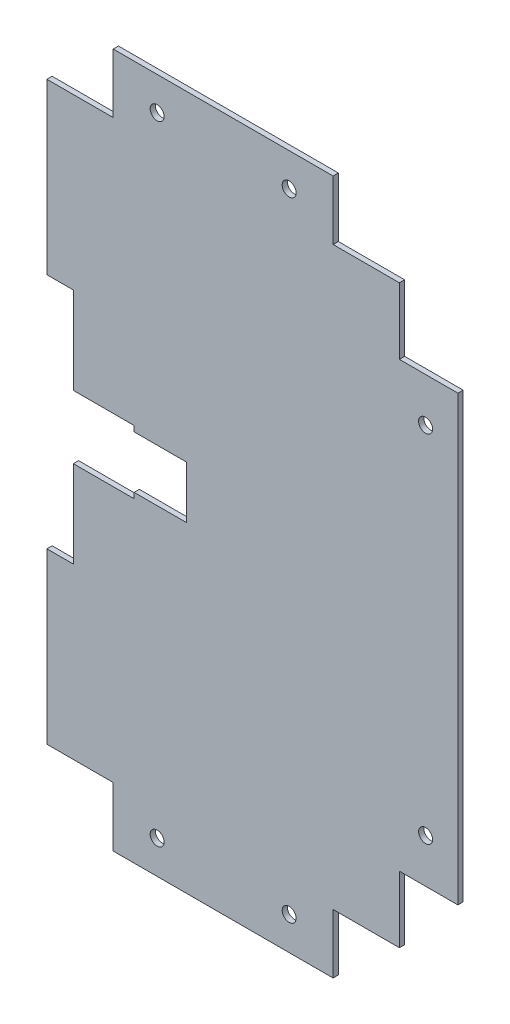
ISO-10303-21;
HEADER;
FILE_DESCRIPTION(('STEP AP214'),'2;1');
FILE_NAME('part.step','',(''),(''),'','','');
FILE_SCHEMA(('AUTOMOTIVE_DESIGN { 1 0 10303 214 1 1 1 1 }'));
ENDSEC;
DATA;
#1=APPLICATION_CONTEXT('core data for automotive mechanical design processes');
#2=APPLICATION_PROTOCOL_DEFINITION('international standard','automotive_design',2000,#1);
#3=PRODUCT_CONTEXT('',#1,'mechanical');
#4=PRODUCT('Part','Part','',(#3));
#5=PRODUCT_RELATED_PRODUCT_CATEGORY('part','',(#4));
#6=PRODUCT_DEFINITION_FORMATION('','',#4);
#7=PRODUCT_DEFINITION_CONTEXT('part definition',#1,'design');
#8=PRODUCT_DEFINITION('design','',#6,#7);
#9=PRODUCT_DEFINITION_SHAPE('','',#8);
#10=(LENGTH_UNIT() NAMED_UNIT(*) SI_UNIT(.MILLI.,.METRE.));
#11=(NAMED_UNIT(*) PLANE_ANGLE_UNIT() SI_UNIT($,.RADIAN.));
#12=(NAMED_UNIT(*) SI_UNIT($,.STERADIAN.) SOLID_ANGLE_UNIT());
#13=UNCERTAINTY_MEASURE_WITH_UNIT(LENGTH_MEASURE(1.E-05),#10,'distance_accuracy_value','');
#14=(GEOMETRIC_REPRESENTATION_CONTEXT(3) GLOBAL_UNCERTAINTY_ASSIGNED_CONTEXT((#13)) GLOBAL_UNIT_ASSIGNED_CONTEXT((#10,
#11,#12)) REPRESENTATION_CONTEXT('',''));
#15=CARTESIAN_POINT('',(0.,0.,0.));
#16=DIRECTION('',(0.,0.,1.));
#17=DIRECTION('',(1.,0.,0.));
#18=AXIS2_PLACEMENT_3D('',#15,#16,#17);
#19=CARTESIAN_POINT('',(76.83,0.,3.));
#20=DIRECTION('',(-1.,0.,0.));
#21=DIRECTION('',(0.,0.,1.));
#22=AXIS2_PLACEMENT_3D('',#19,#20,#21);
#23=PLANE('',#22);
#24=DIRECTION('',(0.,1.,0.));
#25=VECTOR('',#24,1.);
#26=CARTESIAN_POINT('',(76.83,0.,0.));
#27=LINE('',#26,#25);
#28=CARTESIAN_POINT('',(76.83,183.995,0.));
#29=VERTEX_POINT('',#28);
#30=CARTESIAN_POINT('',(76.83,213.995,0.));
#31=VERTEX_POINT('',#30);
#32=EDGE_CURVE('E285',#29,#31,#27,.T.);
#33=ORIENTED_EDGE('',*,*,#32,.F.);
#34=DIRECTION('',(0.,0.,-1.));
#35=VECTOR('',#34,1.);
#36=CARTESIAN_POINT('',(76.83,183.995,3.));
#37=LINE('',#36,#35);
#38=CARTESIAN_POINT('',(76.83,183.995,3.));
#39=VERTEX_POINT('',#38);
#40=EDGE_CURVE('E11',#39,#29,#37,.T.);
#41=ORIENTED_EDGE('',*,*,#40,.F.);
#42=DIRECTION('',(0.,1.,0.));
#43=VECTOR('',#42,1.);
#44=CARTESIAN_POINT('',(76.83,0.,3.));
#45=LINE('',#44,#43);
#46=CARTESIAN_POINT('',(76.83,213.995,3.));
#47=VERTEX_POINT('',#46);
#48=EDGE_CURVE('E509',#39,#47,#45,.T.);
#49=ORIENTED_EDGE('',*,*,#48,.T.);
#50=DIRECTION('',(0.,0.,-1.));
#51=VECTOR('',#50,1.);
#52=CARTESIAN_POINT('',(76.83,213.995,3.));
#53=LINE('',#52,#51);
#54=EDGE_CURVE('E153',#47,#31,#53,.T.);
#55=ORIENTED_EDGE('',*,*,#54,.T.);
#56=EDGE_LOOP('',(#33,#41,#49,#55));
#57=FACE_BOUND('',#56,.T.);
#58=ADVANCED_FACE('F41',(#57),#23,.T.);
#59=CARTESIAN_POINT('',(0.,183.995,3.));
#60=DIRECTION('',(0.,1.,0.));
#61=DIRECTION('',(0.,0.,1.));
#62=AXIS2_PLACEMENT_3D('',#59,#60,#61);
#63=PLANE('',#62);
#64=DIRECTION('',(1.,0.,0.));
#65=VECTOR('',#64,1.);
#66=CARTESIAN_POINT('',(0.,183.995,0.));
#67=LINE('',#66,#65);
#68=CARTESIAN_POINT('',(46.835,183.995,0.));
#69=VERTEX_POINT('',#68);
#70=EDGE_CURVE('E289',#69,#29,#67,.T.);
#71=ORIENTED_EDGE('',*,*,#70,.F.);
#72=DIRECTION('',(0.,0.,-1.));
#73=VECTOR('',#72,1.);
#74=CARTESIAN_POINT('',(46.835,183.995,3.));
#75=LINE('',#74,#73);
#76=CARTESIAN_POINT('',(46.835,183.995,3.));
#77=VERTEX_POINT('',#76);
#78=EDGE_CURVE('E51',#77,#69,#75,.T.);
#79=ORIENTED_EDGE('',*,*,#78,.F.);
#80=DIRECTION('',(1.,0.,0.));
#81=VECTOR('',#80,1.);
#82=CARTESIAN_POINT('',(0.,183.995,3.));
#83=LINE('',#82,#81);
#84=EDGE_CURVE('E507',#77,#39,#83,.T.);
#85=ORIENTED_EDGE('',*,*,#84,.T.);
#86=ORIENTED_EDGE('',*,*,#40,.T.);
#87=EDGE_LOOP('',(#71,#79,#85,#86));
#88=FACE_BOUND('',#87,.T.);
#89=ADVANCED_FACE('F506',(#88),#63,.T.);
#90=CARTESIAN_POINT('',(46.8350000000003,0.,3.));
#91=DIRECTION('',(1.,0.,0.));
#92=DIRECTION('',(0.,1.,0.));
#93=AXIS2_PLACEMENT_3D('',#90,#91,#92);
#94=PLANE('',#93);
#95=DIRECTION('',(0.,-1.,0.));
#96=VECTOR('',#95,1.);
#97=CARTESIAN_POINT('',(46.8350000000003,0.,0.));
#98=LINE('',#97,#96);
#99=CARTESIAN_POINT('',(46.835,180.82,0.));
#100=VERTEX_POINT('',#99);
#101=EDGE_CURVE('E293',#69,#100,#98,.T.);
#102=ORIENTED_EDGE('',*,*,#101,.T.);
#103=DIRECTION('',(0.,0.,-1.));
#104=VECTOR('',#103,1.);
#105=CARTESIAN_POINT('',(46.835,180.82,3.));
#106=LINE('',#105,#104);
#107=CARTESIAN_POINT('',(46.835,180.82,3.));
#108=VERTEX_POINT('',#107);
#109=EDGE_CURVE('E488',#108,#100,#106,.T.);
#110=ORIENTED_EDGE('',*,*,#109,.F.);
#111=DIRECTION('',(0.,-1.,0.));
#112=VECTOR('',#111,1.);
#113=CARTESIAN_POINT('',(46.8350000000003,0.,3.));
#114=LINE('',#113,#112);
#115=EDGE_CURVE('E498',#77,#108,#114,.T.);
#116=ORIENTED_EDGE('',*,*,#115,.F.);
#117=ORIENTED_EDGE('',*,*,#78,.T.);
#118=EDGE_LOOP('',(#102,#110,#116,#117));
#119=FACE_BOUND('',#118,.T.);
#120=ADVANCED_FACE('F495',(#119),#94,.F.);
#121=CARTESIAN_POINT('',(-1.44093114637325E-13,180.82,3.));
#122=DIRECTION('',(0.,-1.,0.));
#123=DIRECTION('',(1.,0.,0.));
#124=AXIS2_PLACEMENT_3D('',#121,#122,#123);
#125=PLANE('',#124);
#126=DIRECTION('',(-1.,0.,0.));
#127=VECTOR('',#126,1.);
#128=CARTESIAN_POINT('',(-1.44093114637325E-13,180.82,0.));
#129=LINE('',#128,#127);
#130=CARTESIAN_POINT('',(12.005,180.82,0.));
#131=VERTEX_POINT('',#130);
#132=EDGE_CURVE('E297',#100,#131,#129,.T.);
#133=ORIENTED_EDGE('',*,*,#132,.T.);
#134=DIRECTION('',(0.,0.,-1.));
#135=VECTOR('',#134,1.);
#136=CARTESIAN_POINT('',(12.005,180.82,3.));
#137=LINE('',#136,#135);
#138=CARTESIAN_POINT('',(12.005,180.82,3.));
#139=VERTEX_POINT('',#138);
#140=EDGE_CURVE('E484',#139,#131,#137,.T.);
#141=ORIENTED_EDGE('',*,*,#140,.F.);
#142=DIRECTION('',(-1.,0.,0.));
#143=VECTOR('',#142,1.);
#144=CARTESIAN_POINT('',(-1.44093114637325E-13,180.82,3.));
#145=LINE('',#144,#143);
#146=EDGE_CURVE('E520',#108,#139,#145,.T.);
#147=ORIENTED_EDGE('',*,*,#146,.F.);
#148=ORIENTED_EDGE('',*,*,#109,.T.);
#149=EDGE_LOOP('',(#133,#141,#147,#148));
#150=FACE_BOUND('',#149,.T.);
#151=ADVANCED_FACE('F681',(#150),#125,.F.);
#152=CARTESIAN_POINT('',(12.005,0.,3.));
#153=DIRECTION('',(1.,0.,0.));
#154=DIRECTION('',(0.,0.,-1.));
#155=AXIS2_PLACEMENT_3D('',#152,#153,#154);
#156=PLANE('',#155);
#157=DIRECTION('',(0.,-1.,0.));
#158=VECTOR('',#157,1.);
#159=CARTESIAN_POINT('',(12.005,0.,0.));
#160=LINE('',#159,#158);
#161=CARTESIAN_POINT('',(12.005,130.995,0.));
#162=VERTEX_POINT('',#161);
#163=EDGE_CURVE('E301',#131,#162,#160,.T.);
#164=ORIENTED_EDGE('',*,*,#163,.T.);
#165=DIRECTION('',(0.,0.,-1.));
#166=VECTOR('',#165,1.);
#167=CARTESIAN_POINT('',(12.005,130.995,3.));
#168=LINE('',#167,#166);
#169=CARTESIAN_POINT('',(12.005,130.995,3.));
#170=VERTEX_POINT('',#169);
#171=EDGE_CURVE('E480',#170,#162,#168,.T.);
#172=ORIENTED_EDGE('',*,*,#171,.F.);
#173=DIRECTION('',(0.,-1.,0.));
#174=VECTOR('',#173,1.);
#175=CARTESIAN_POINT('',(12.005,0.,3.));
#176=LINE('',#175,#174);
#177=EDGE_CURVE('E524',#139,#170,#176,.T.);
#178=ORIENTED_EDGE('',*,*,#177,.F.);
#179=ORIENTED_EDGE('',*,*,#140,.T.);
#180=EDGE_LOOP('',(#164,#172,#178,#179));
#181=FACE_BOUND('',#180,.T.);
#182=ADVANCED_FACE('F678',(#181),#156,.F.);
#183=CARTESIAN_POINT('',(0.,130.995,3.));
#184=DIRECTION('',(0.,-1.,0.));
#185=DIRECTION('',(0.,0.,-1.));
#186=AXIS2_PLACEMENT_3D('',#183,#184,#185);
#187=PLANE('',#186);
#188=DIRECTION('',(-1.,0.,0.));
#189=VECTOR('',#188,1.);
#190=CARTESIAN_POINT('',(0.,130.995,0.));
#191=LINE('',#190,#189);
#192=CARTESIAN_POINT('',(-3.17500000000001,130.995,0.));
#193=VERTEX_POINT('',#192);
#194=EDGE_CURVE('E305',#162,#193,#191,.T.);
#195=ORIENTED_EDGE('',*,*,#194,.T.);
#196=DIRECTION('',(0.,0.,-1.));
#197=VECTOR('',#196,1.);
#198=CARTESIAN_POINT('',(-3.17500000000001,130.995,3.));
#199=LINE('',#198,#197);
#200=CARTESIAN_POINT('',(-3.17500000000001,130.995,3.));
#201=VERTEX_POINT('',#200);
#202=EDGE_CURVE('E477',#201,#193,#199,.T.);
#203=ORIENTED_EDGE('',*,*,#202,.F.);
#204=DIRECTION('',(-1.,0.,0.));
#205=VECTOR('',#204,1.);
#206=CARTESIAN_POINT('',(0.,130.995,3.));
#207=LINE('',#206,#205);
#208=EDGE_CURVE('E528',#170,#201,#207,.T.);
#209=ORIENTED_EDGE('',*,*,#208,.F.);
#210=ORIENTED_EDGE('',*,*,#171,.T.);
#211=EDGE_LOOP('',(#195,#203,#209,#210));
#212=FACE_BOUND('',#211,.T.);
#213=ADVANCED_FACE('F676',(#212),#187,.F.);
#214=CARTESIAN_POINT('',(-3.17500000000001,0.,3.));
#215=DIRECTION('',(-1.,0.,0.));
#216=DIRECTION('',(0.,0.,1.));
#217=AXIS2_PLACEMENT_3D('',#214,#215,#216);
#218=PLANE('',#217);
#219=DIRECTION('',(0.,1.,0.));
#220=VECTOR('',#219,1.);
#221=CARTESIAN_POINT('',(-3.17500000000001,0.,0.));
#222=LINE('',#221,#220);
#223=CARTESIAN_POINT('',(-3.17500000000001,34.005,0.));
#224=VERTEX_POINT('',#223);
#225=EDGE_CURVE('E309',#224,#193,#222,.T.);
#226=ORIENTED_EDGE('',*,*,#225,.F.);
#227=DIRECTION('',(0.,0.,-1.));
#228=VECTOR('',#227,1.);
#229=CARTESIAN_POINT('',(-3.17500000000001,34.005,3.));
#230=LINE('',#229,#228);
#231=CARTESIAN_POINT('',(-3.17500000000001,34.005,3.));
#232=VERTEX_POINT('',#231);
#233=EDGE_CURVE('E474',#232,#224,#230,.T.);
#234=ORIENTED_EDGE('',*,*,#233,.F.);
#235=DIRECTION('',(0.,1.,0.));
#236=VECTOR('',#235,1.);
#237=CARTESIAN_POINT('',(-3.17500000000001,0.,3.));
#238=LINE('',#237,#236);
#239=EDGE_CURVE('E531',#232,#201,#238,.T.);
#240=ORIENTED_EDGE('',*,*,#239,.T.);
#241=ORIENTED_EDGE('',*,*,#202,.T.);
#242=EDGE_LOOP('',(#226,#234,#240,#241));
#243=FACE_BOUND('',#242,.T.);
#244=ADVANCED_FACE('F672',(#243),#218,.T.);
#245=CARTESIAN_POINT('',(0.,34.005,3.));
#246=DIRECTION('',(0.,1.,0.));
#247=DIRECTION('',(0.,0.,1.));
#248=AXIS2_PLACEMENT_3D('',#245,#246,#247);
#249=PLANE('',#248);
#250=DIRECTION('',(1.,0.,0.));
#251=VECTOR('',#250,1.);
#252=CARTESIAN_POINT('',(0.,34.005,0.));
#253=LINE('',#252,#251);
#254=CARTESIAN_POINT('',(34.825,34.005,0.));
#255=VERTEX_POINT('',#254);
#256=EDGE_CURVE('E313',#224,#255,#253,.T.);
#257=ORIENTED_EDGE('',*,*,#256,.T.);
#258=DIRECTION('',(0.,0.,-1.));
#259=VECTOR('',#258,1.);
#260=CARTESIAN_POINT('',(34.825,34.005,3.));
#261=LINE('',#260,#259);
#262=CARTESIAN_POINT('',(34.825,34.005,3.));
#263=VERTEX_POINT('',#262);
#264=EDGE_CURVE('E470',#263,#255,#261,.T.);
#265=ORIENTED_EDGE('',*,*,#264,.F.);
#266=DIRECTION('',(1.,0.,0.));
#267=VECTOR('',#266,1.);
#268=CARTESIAN_POINT('',(0.,34.005,3.));
#269=LINE('',#268,#267);
#270=EDGE_CURVE('E535',#232,#263,#269,.T.);
#271=ORIENTED_EDGE('',*,*,#270,.F.);
#272=ORIENTED_EDGE('',*,*,#233,.T.);
#273=EDGE_LOOP('',(#257,#265,#271,#272));
#274=FACE_BOUND('',#273,.T.);
#275=ADVANCED_FACE('F669',(#274),#249,.F.);
#276=CARTESIAN_POINT('',(34.825,0.,3.));
#277=DIRECTION('',(1.,0.,0.));
#278=DIRECTION('',(0.,1.,0.));
#279=AXIS2_PLACEMENT_3D('',#276,#277,#278);
#280=PLANE('',#279);
#281=DIRECTION('',(0.,-1.,0.));
#282=VECTOR('',#281,1.);
#283=CARTESIAN_POINT('',(34.825,0.,0.));
#284=LINE('',#283,#282);
#285=CARTESIAN_POINT('',(34.825,0.,0.));
#286=VERTEX_POINT('',#285);
#287=EDGE_CURVE('E317',#255,#286,#284,.T.);
#288=ORIENTED_EDGE('',*,*,#287,.T.);
#289=DIRECTION('',(0.,0.,-1.));
#290=VECTOR('',#289,1.);
#291=CARTESIAN_POINT('',(34.825,0.,3.));
#292=LINE('',#291,#290);
#293=CARTESIAN_POINT('',(34.825,0.,3.));
#294=VERTEX_POINT('',#293);
#295=EDGE_CURVE('E466',#294,#286,#292,.T.);
#296=ORIENTED_EDGE('',*,*,#295,.F.);
#297=DIRECTION('',(0.,-1.,0.));
#298=VECTOR('',#297,1.);
#299=CARTESIAN_POINT('',(34.825,0.,3.));
#300=LINE('',#299,#298);
#301=EDGE_CURVE('E539',#263,#294,#300,.T.);
#302=ORIENTED_EDGE('',*,*,#301,.F.);
#303=ORIENTED_EDGE('',*,*,#264,.T.);
#304=EDGE_LOOP('',(#288,#296,#302,#303));
#305=FACE_BOUND('',#304,.T.);
#306=ADVANCED_FACE('F666',(#305),#280,.F.);
#307=CARTESIAN_POINT('',(0.,0.,3.));
#308=DIRECTION('',(0.,1.,0.));
#309=DIRECTION('',(0.,0.,1.));
#310=AXIS2_PLACEMENT_3D('',#307,#308,#309);
#311=PLANE('',#310);
#312=DIRECTION('',(1.,0.,0.));
#313=VECTOR('',#312,1.);
#314=CARTESIAN_POINT('',(0.,0.,0.));
#315=LINE('',#314,#313);
#316=CARTESIAN_POINT('',(160.82,0.,0.));
#317=VERTEX_POINT('',#316);
#318=EDGE_CURVE('E321',#286,#317,#315,.T.);
#319=ORIENTED_EDGE('',*,*,#318,.T.);
#320=DIRECTION('',(0.,0.,-1.));
#321=VECTOR('',#320,1.);
#322=CARTESIAN_POINT('',(160.82,0.,3.));
#323=LINE('',#322,#321);
#324=CARTESIAN_POINT('',(160.82,0.,3.));
#325=VERTEX_POINT('',#324);
#326=EDGE_CURVE('E463',#325,#317,#323,.T.);
#327=ORIENTED_EDGE('',*,*,#326,.F.);
#328=DIRECTION('',(1.,0.,0.));
#329=VECTOR('',#328,1.);
#330=CARTESIAN_POINT('',(0.,0.,3.));
#331=LINE('',#330,#329);
#332=EDGE_CURVE('E543',#294,#325,#331,.T.);
#333=ORIENTED_EDGE('',*,*,#332,.F.);
#334=ORIENTED_EDGE('',*,*,#295,.T.);
#335=EDGE_LOOP('',(#319,#327,#333,#334));
#336=FACE_BOUND('',#335,.T.);
#337=ADVANCED_FACE('F660',(#336),#311,.F.);
#338=CARTESIAN_POINT('',(160.82,0.,3.));
#339=DIRECTION('',(1.,0.,0.));
#340=DIRECTION('',(0.,0.,-1.));
#341=AXIS2_PLACEMENT_3D('',#338,#339,#340);
#342=PLANE('',#341);
#343=DIRECTION('',(0.,-1.,0.));
#344=VECTOR('',#343,1.);
#345=CARTESIAN_POINT('',(160.82,0.,0.));
#346=LINE('',#345,#344);
#347=CARTESIAN_POINT('',(160.82,34.005,0.));
#348=VERTEX_POINT('',#347);
#349=EDGE_CURVE('E325',#348,#317,#346,.T.);
#350=ORIENTED_EDGE('',*,*,#349,.F.);
#351=DIRECTION('',(0.,0.,-1.));
#352=VECTOR('',#351,1.);
#353=CARTESIAN_POINT('',(160.82,34.005,3.));
#354=LINE('',#353,#352);
#355=CARTESIAN_POINT('',(160.82,34.005,3.));
#356=VERTEX_POINT('',#355);
#357=EDGE_CURVE('E460',#356,#348,#354,.T.);
#358=ORIENTED_EDGE('',*,*,#357,.F.);
#359=DIRECTION('',(0.,-1.,0.));
#360=VECTOR('',#359,1.);
#361=CARTESIAN_POINT('',(160.82,0.,3.));
#362=LINE('',#361,#360);
#363=EDGE_CURVE('E546',#356,#325,#362,.T.);
#364=ORIENTED_EDGE('',*,*,#363,.T.);
#365=ORIENTED_EDGE('',*,*,#326,.T.);
#366=EDGE_LOOP('',(#350,#358,#364,#365));
#367=FACE_BOUND('',#366,.T.);
#368=ADVANCED_FACE('F656',(#367),#342,.T.);
#369=CARTESIAN_POINT('',(0.,34.005,3.));
#370=DIRECTION('',(0.,1.,0.));
#371=DIRECTION('',(-1.,0.,0.));
#372=AXIS2_PLACEMENT_3D('',#369,#370,#371);
#373=PLANE('',#372);
#374=DIRECTION('',(1.,0.,0.));
#375=VECTOR('',#374,1.);
#376=CARTESIAN_POINT('',(0.,34.005,0.));
#377=LINE('',#376,#375);
#378=CARTESIAN_POINT('',(198.82,34.005,0.));
#379=VERTEX_POINT('',#378);
#380=EDGE_CURVE('E329',#348,#379,#377,.T.);
#381=ORIENTED_EDGE('',*,*,#380,.T.);
#382=DIRECTION('',(0.,0.,-1.));
#383=VECTOR('',#382,1.);
#384=CARTESIAN_POINT('',(198.82,34.005,3.));
#385=LINE('',#384,#383);
#386=CARTESIAN_POINT('',(198.82,34.005,3.));
#387=VERTEX_POINT('',#386);
#388=EDGE_CURVE('E457',#387,#379,#385,.T.);
#389=ORIENTED_EDGE('',*,*,#388,.F.);
#390=DIRECTION('',(1.,0.,0.));
#391=VECTOR('',#390,1.);
#392=CARTESIAN_POINT('',(0.,34.005,3.));
#393=LINE('',#392,#391);
#394=EDGE_CURVE('E550',#356,#387,#393,.T.);
#395=ORIENTED_EDGE('',*,*,#394,.F.);
#396=ORIENTED_EDGE('',*,*,#357,.T.);
#397=EDGE_LOOP('',(#381,#389,#395,#396));
#398=FACE_BOUND('',#397,.T.);
#399=ADVANCED_FACE('F653',(#398),#373,.F.);
#400=CARTESIAN_POINT('',(198.82,0.,3.));
#401=DIRECTION('',(1.,0.,0.));
#402=DIRECTION('',(0.,0.,-1.));
#403=AXIS2_PLACEMENT_3D('',#400,#401,#402);
#404=PLANE('',#403);
#405=DIRECTION('',(0.,-1.,0.));
#406=VECTOR('',#405,1.);
#407=CARTESIAN_POINT('',(198.82,0.,0.));
#408=LINE('',#407,#406);
#409=CARTESIAN_POINT('',(198.82,72.005,0.));
#410=VERTEX_POINT('',#409);
#411=EDGE_CURVE('E333',#410,#379,#408,.T.);
#412=ORIENTED_EDGE('',*,*,#411,.F.);
#413=DIRECTION('',(0.,0.,-1.));
#414=VECTOR('',#413,1.);
#415=CARTESIAN_POINT('',(198.82,72.005,3.));
#416=LINE('',#415,#414);
#417=CARTESIAN_POINT('',(198.82,72.005,3.));
#418=VERTEX_POINT('',#417);
#419=EDGE_CURVE('E454',#418,#410,#416,.T.);
#420=ORIENTED_EDGE('',*,*,#419,.F.);
#421=DIRECTION('',(0.,-1.,0.));
#422=VECTOR('',#421,1.);
#423=CARTESIAN_POINT('',(198.82,0.,3.));
#424=LINE('',#423,#422);
#425=EDGE_CURVE('E553',#418,#387,#424,.T.);
#426=ORIENTED_EDGE('',*,*,#425,.T.);
#427=ORIENTED_EDGE('',*,*,#388,.T.);
#428=EDGE_LOOP('',(#412,#420,#426,#427));
#429=FACE_BOUND('',#428,.T.);
#430=ADVANCED_FACE('F647',(#429),#404,.T.);
#431=CARTESIAN_POINT('',(0.,72.005,3.));
#432=DIRECTION('',(0.,1.,0.));
#433=DIRECTION('',(0.,0.,1.));
#434=AXIS2_PLACEMENT_3D('',#431,#432,#433);
#435=PLANE('',#434);
#436=DIRECTION('',(1.,0.,0.));
#437=VECTOR('',#436,1.);
#438=CARTESIAN_POINT('',(0.,72.005,0.));
#439=LINE('',#438,#437);
#440=CARTESIAN_POINT('',(232.325,72.005,0.));
#441=VERTEX_POINT('',#440);
#442=EDGE_CURVE('E337',#410,#441,#439,.T.);
#443=ORIENTED_EDGE('',*,*,#442,.T.);
#444=DIRECTION('',(0.,0.,-1.));
#445=VECTOR('',#444,1.);
#446=CARTESIAN_POINT('',(232.325,72.005,3.));
#447=LINE('',#446,#445);
#448=CARTESIAN_POINT('',(232.325,72.005,3.));
#449=VERTEX_POINT('',#448);
#450=EDGE_CURVE('E450',#449,#441,#447,.T.);
#451=ORIENTED_EDGE('',*,*,#450,.F.);
#452=DIRECTION('',(1.,0.,0.));
#453=VECTOR('',#452,1.);
#454=CARTESIAN_POINT('',(0.,72.005,3.));
#455=LINE('',#454,#453);
#456=EDGE_CURVE('E557',#418,#449,#455,.T.);
#457=ORIENTED_EDGE('',*,*,#456,.F.);
#458=ORIENTED_EDGE('',*,*,#419,.T.);
#459=EDGE_LOOP('',(#443,#451,#457,#458));
#460=FACE_BOUND('',#459,.T.);
#461=ADVANCED_FACE('F682',(#460),#435,.F.);
#462=CARTESIAN_POINT('',(232.325,0.,3.));
#463=DIRECTION('',(-1.,0.,0.));
#464=DIRECTION('',(0.,0.,1.));
#465=AXIS2_PLACEMENT_3D('',#462,#463,#464);
#466=PLANE('',#465);
#467=DIRECTION('',(0.,1.,0.));
#468=VECTOR('',#467,1.);
#469=CARTESIAN_POINT('',(232.325,0.,0.));
#470=LINE('',#469,#468);
#471=CARTESIAN_POINT('',(232.325,325.985,0.));
#472=VERTEX_POINT('',#471);
#473=EDGE_CURVE('E341',#441,#472,#470,.T.);
#474=ORIENTED_EDGE('',*,*,#473,.T.);
#475=DIRECTION('',(0.,0.,-1.));
#476=VECTOR('',#475,1.);
#477=CARTESIAN_POINT('',(232.325,325.985,3.));
#478=LINE('',#477,#476);
#479=CARTESIAN_POINT('',(232.325,325.985,3.));
#480=VERTEX_POINT('',#479);
#481=EDGE_CURVE('E447',#480,#472,#478,.T.);
#482=ORIENTED_EDGE('',*,*,#481,.F.);
#483=DIRECTION('',(0.,1.,0.));
#484=VECTOR('',#483,1.);
#485=CARTESIAN_POINT('',(232.325,0.,3.));
#486=LINE('',#485,#484);
#487=EDGE_CURVE('E561',#449,#480,#486,.T.);
#488=ORIENTED_EDGE('',*,*,#487,.F.);
#489=ORIENTED_EDGE('',*,*,#450,.T.);
#490=EDGE_LOOP('',(#474,#482,#488,#489));
#491=FACE_BOUND('',#490,.T.);
#492=ADVANCED_FACE('F640',(#491),#466,.F.);
#493=CARTESIAN_POINT('',(0.,325.985,3.));
#494=DIRECTION('',(0.,1.,0.));
#495=DIRECTION('',(0.,0.,1.));
#496=AXIS2_PLACEMENT_3D('',#493,#494,#495);
#497=PLANE('',#496);
#498=DIRECTION('',(1.,0.,0.));
#499=VECTOR('',#498,1.);
#500=CARTESIAN_POINT('',(0.,325.985,0.));
#501=LINE('',#500,#499);
#502=CARTESIAN_POINT('',(198.82,325.985,0.));
#503=VERTEX_POINT('',#502);
#504=EDGE_CURVE('E345',#503,#472,#501,.T.);
#505=ORIENTED_EDGE('',*,*,#504,.F.);
#506=DIRECTION('',(0.,0.,-1.));
#507=VECTOR('',#506,1.);
#508=CARTESIAN_POINT('',(198.82,325.985,3.));
#509=LINE('',#508,#507);
#510=CARTESIAN_POINT('',(198.82,325.985,3.));
#511=VERTEX_POINT('',#510);
#512=EDGE_CURVE('E444',#511,#503,#509,.T.);
#513=ORIENTED_EDGE('',*,*,#512,.F.);
#514=DIRECTION('',(1.,0.,0.));
#515=VECTOR('',#514,1.);
#516=CARTESIAN_POINT('',(0.,325.985,3.));
#517=LINE('',#516,#515);
#518=EDGE_CURVE('E564',#511,#480,#517,.T.);
#519=ORIENTED_EDGE('',*,*,#518,.T.);
#520=ORIENTED_EDGE('',*,*,#481,.T.);
#521=EDGE_LOOP('',(#505,#513,#519,#520));
#522=FACE_BOUND('',#521,.T.);
#523=ADVANCED_FACE('F636',(#522),#497,.T.);
#524=CARTESIAN_POINT('',(198.82,0.,3.));
#525=DIRECTION('',(-1.,0.,0.));
#526=DIRECTION('',(0.,0.,1.));
#527=AXIS2_PLACEMENT_3D('',#524,#525,#526);
#528=PLANE('',#527);
#529=DIRECTION('',(0.,1.,0.));
#530=VECTOR('',#529,1.);
#531=CARTESIAN_POINT('',(198.82,0.,0.));
#532=LINE('',#531,#530);
#533=CARTESIAN_POINT('',(198.82,363.985,0.));
#534=VERTEX_POINT('',#533);
#535=EDGE_CURVE('E349',#503,#534,#532,.T.);
#536=ORIENTED_EDGE('',*,*,#535,.T.);
#537=DIRECTION('',(0.,0.,-1.));
#538=VECTOR('',#537,1.);
#539=CARTESIAN_POINT('',(198.82,363.985,3.));
#540=LINE('',#539,#538);
#541=CARTESIAN_POINT('',(198.82,363.985,3.));
#542=VERTEX_POINT('',#541);
#543=EDGE_CURVE('E441',#542,#534,#540,.T.);
#544=ORIENTED_EDGE('',*,*,#543,.F.);
#545=DIRECTION('',(0.,1.,0.));
#546=VECTOR('',#545,1.);
#547=CARTESIAN_POINT('',(198.82,0.,3.));
#548=LINE('',#547,#546);
#549=EDGE_CURVE('E568',#511,#542,#548,.T.);
#550=ORIENTED_EDGE('',*,*,#549,.F.);
#551=ORIENTED_EDGE('',*,*,#512,.T.);
#552=EDGE_LOOP('',(#536,#544,#550,#551));
#553=FACE_BOUND('',#552,.T.);
#554=ADVANCED_FACE('F633',(#553),#528,.F.);
#555=CARTESIAN_POINT('',(5.31716483708142E-13,363.985,3.));
#556=DIRECTION('',(0.,1.,0.));
#557=DIRECTION('',(-1.,0.,0.));
#558=AXIS2_PLACEMENT_3D('',#555,#556,#557);
#559=PLANE('',#558);
#560=DIRECTION('',(1.,0.,0.));
#561=VECTOR('',#560,1.);
#562=CARTESIAN_POINT('',(5.31716483708142E-13,363.985,0.));
#563=LINE('',#562,#561);
#564=CARTESIAN_POINT('',(160.82,363.985,0.));
#565=VERTEX_POINT('',#564);
#566=EDGE_CURVE('E353',#565,#534,#563,.T.);
#567=ORIENTED_EDGE('',*,*,#566,.F.);
#568=DIRECTION('',(0.,0.,-1.));
#569=VECTOR('',#568,1.);
#570=CARTESIAN_POINT('',(160.82,363.985,3.));
#571=LINE('',#570,#569);
#572=CARTESIAN_POINT('',(160.82,363.985,3.));
#573=VERTEX_POINT('',#572);
#574=EDGE_CURVE('E438',#573,#565,#571,.T.);
#575=ORIENTED_EDGE('',*,*,#574,.F.);
#576=DIRECTION('',(1.,0.,0.));
#577=VECTOR('',#576,1.);
#578=CARTESIAN_POINT('',(5.31716483708142E-13,363.985,3.));
#579=LINE('',#578,#577);
#580=EDGE_CURVE('E571',#573,#542,#579,.T.);
#581=ORIENTED_EDGE('',*,*,#580,.T.);
#582=ORIENTED_EDGE('',*,*,#543,.T.);
#583=EDGE_LOOP('',(#567,#575,#581,#582));
#584=FACE_BOUND('',#583,.T.);
#585=ADVANCED_FACE('F628',(#584),#559,.T.);
#586=CARTESIAN_POINT('',(160.82,0.,3.));
#587=DIRECTION('',(-1.,0.,0.));
#588=DIRECTION('',(0.,0.,1.));
#589=AXIS2_PLACEMENT_3D('',#586,#587,#588);
#590=PLANE('',#589);
#591=DIRECTION('',(0.,1.,0.));
#592=VECTOR('',#591,1.);
#593=CARTESIAN_POINT('',(160.82,0.,0.));
#594=LINE('',#593,#592);
#595=CARTESIAN_POINT('',(160.82,397.99,0.));
#596=VERTEX_POINT('',#595);
#597=EDGE_CURVE('E357',#565,#596,#594,.T.);
#598=ORIENTED_EDGE('',*,*,#597,.T.);
#599=DIRECTION('',(0.,0.,-1.));
#600=VECTOR('',#599,1.);
#601=CARTESIAN_POINT('',(160.82,397.99,3.));
#602=LINE('',#601,#600);
#603=CARTESIAN_POINT('',(160.82,397.99,3.));
#604=VERTEX_POINT('',#603);
#605=EDGE_CURVE('E435',#604,#596,#602,.T.);
#606=ORIENTED_EDGE('',*,*,#605,.F.);
#607=DIRECTION('',(0.,1.,0.));
#608=VECTOR('',#607,1.);
#609=CARTESIAN_POINT('',(160.82,0.,3.));
#610=LINE('',#609,#608);
#611=EDGE_CURVE('E575',#573,#604,#610,.T.);
#612=ORIENTED_EDGE('',*,*,#611,.F.);
#613=ORIENTED_EDGE('',*,*,#574,.T.);
#614=EDGE_LOOP('',(#598,#606,#612,#613));
#615=FACE_BOUND('',#614,.T.);
#616=ADVANCED_FACE('F624',(#615),#590,.F.);
#617=CARTESIAN_POINT('',(0.,397.99,3.));
#618=DIRECTION('',(0.,1.,0.));
#619=DIRECTION('',(0.,0.,1.));
#620=AXIS2_PLACEMENT_3D('',#617,#618,#619);
#621=PLANE('',#620);
#622=DIRECTION('',(1.,0.,0.));
#623=VECTOR('',#622,1.);
#624=CARTESIAN_POINT('',(0.,397.99,0.));
#625=LINE('',#624,#623);
#626=CARTESIAN_POINT('',(34.825,397.99,0.));
#627=VERTEX_POINT('',#626);
#628=EDGE_CURVE('E361',#627,#596,#625,.T.);
#629=ORIENTED_EDGE('',*,*,#628,.F.);
#630=DIRECTION('',(0.,0.,-1.));
#631=VECTOR('',#630,1.);
#632=CARTESIAN_POINT('',(34.825,397.99,3.));
#633=LINE('',#632,#631);
#634=CARTESIAN_POINT('',(34.825,397.99,3.));
#635=VERTEX_POINT('',#634);
#636=EDGE_CURVE('E432',#635,#627,#633,.T.);
#637=ORIENTED_EDGE('',*,*,#636,.F.);
#638=DIRECTION('',(1.,0.,0.));
#639=VECTOR('',#638,1.);
#640=CARTESIAN_POINT('',(0.,397.99,3.));
#641=LINE('',#640,#639);
#642=EDGE_CURVE('E578',#635,#604,#641,.T.);
#643=ORIENTED_EDGE('',*,*,#642,.T.);
#644=ORIENTED_EDGE('',*,*,#605,.T.);
#645=EDGE_LOOP('',(#629,#637,#643,#644));
#646=FACE_BOUND('',#645,.T.);
#647=ADVANCED_FACE('F620',(#646),#621,.T.);
#648=CARTESIAN_POINT('',(34.8249999999999,0.,3.));
#649=DIRECTION('',(-1.,0.,0.));
#650=DIRECTION('',(0.,-1.,0.));
#651=AXIS2_PLACEMENT_3D('',#648,#649,#650);
#652=PLANE('',#651);
#653=DIRECTION('',(0.,1.,0.));
#654=VECTOR('',#653,1.);
#655=CARTESIAN_POINT('',(34.8249999999999,0.,0.));
#656=LINE('',#655,#654);
#657=CARTESIAN_POINT('',(34.825,363.985,0.));
#658=VERTEX_POINT('',#657);
#659=EDGE_CURVE('E365',#658,#627,#656,.T.);
#660=ORIENTED_EDGE('',*,*,#659,.F.);
#661=DIRECTION('',(0.,0.,-1.));
#662=VECTOR('',#661,1.);
#663=CARTESIAN_POINT('',(34.825,363.985,3.));
#664=LINE('',#663,#662);
#665=CARTESIAN_POINT('',(34.825,363.985,3.));
#666=VERTEX_POINT('',#665);
#667=EDGE_CURVE('E429',#666,#658,#664,.T.);
#668=ORIENTED_EDGE('',*,*,#667,.F.);
#669=DIRECTION('',(0.,1.,0.));
#670=VECTOR('',#669,1.);
#671=CARTESIAN_POINT('',(34.8249999999999,0.,3.));
#672=LINE('',#671,#670);
#673=EDGE_CURVE('E582',#666,#635,#672,.T.);
#674=ORIENTED_EDGE('',*,*,#673,.T.);
#675=ORIENTED_EDGE('',*,*,#636,.T.);
#676=EDGE_LOOP('',(#660,#668,#674,#675));
#677=FACE_BOUND('',#676,.T.);
#678=ADVANCED_FACE('F616',(#677),#652,.T.);
#679=CARTESIAN_POINT('',(0.,363.985,3.));
#680=DIRECTION('',(0.,1.,0.));
#681=DIRECTION('',(0.,0.,1.));
#682=AXIS2_PLACEMENT_3D('',#679,#680,#681);
#683=PLANE('',#682);
#684=DIRECTION('',(1.,0.,0.));
#685=VECTOR('',#684,1.);
#686=CARTESIAN_POINT('',(0.,363.985,0.));
#687=LINE('',#686,#685);
#688=CARTESIAN_POINT('',(-3.17500000000001,363.985,0.));
#689=VERTEX_POINT('',#688);
#690=EDGE_CURVE('E369',#689,#658,#687,.T.);
#691=ORIENTED_EDGE('',*,*,#690,.F.);
#692=DIRECTION('',(0.,0.,-1.));
#693=VECTOR('',#692,1.);
#694=CARTESIAN_POINT('',(-3.17500000000001,363.985,3.));
#695=LINE('',#694,#693);
#696=CARTESIAN_POINT('',(-3.17500000000001,363.985,3.));
#697=VERTEX_POINT('',#696);
#698=EDGE_CURVE('E426',#697,#689,#695,.T.);
#699=ORIENTED_EDGE('',*,*,#698,.F.);
#700=DIRECTION('',(1.,0.,0.));
#701=VECTOR('',#700,1.);
#702=CARTESIAN_POINT('',(0.,363.985,3.));
#703=LINE('',#702,#701);
#704=EDGE_CURVE('E586',#697,#666,#703,.T.);
#705=ORIENTED_EDGE('',*,*,#704,.T.);
#706=ORIENTED_EDGE('',*,*,#667,.T.);
#707=EDGE_LOOP('',(#691,#699,#705,#706));
#708=FACE_BOUND('',#707,.T.);
#709=ADVANCED_FACE('F611',(#708),#683,.T.);
#710=CARTESIAN_POINT('',(-3.17500000000001,0.,3.));
#711=DIRECTION('',(1.,0.,0.));
#712=DIRECTION('',(0.,0.,-1.));
#713=AXIS2_PLACEMENT_3D('',#710,#711,#712);
#714=PLANE('',#713);
#715=DIRECTION('',(0.,-1.,0.));
#716=VECTOR('',#715,1.);
#717=CARTESIAN_POINT('',(-3.17500000000001,0.,0.));
#718=LINE('',#717,#716);
#719=CARTESIAN_POINT('',(-3.17500000000001,266.995,0.));
#720=VERTEX_POINT('',#719);
#721=EDGE_CURVE('E373',#689,#720,#718,.T.);
#722=ORIENTED_EDGE('',*,*,#721,.T.);
#723=DIRECTION('',(0.,0.,-1.));
#724=VECTOR('',#723,1.);
#725=CARTESIAN_POINT('',(-3.17500000000001,266.995,3.));
#726=LINE('',#725,#724);
#727=CARTESIAN_POINT('',(-3.17500000000001,266.995,3.));
#728=VERTEX_POINT('',#727);
#729=EDGE_CURVE('E423',#728,#720,#726,.T.);
#730=ORIENTED_EDGE('',*,*,#729,.F.);
#731=DIRECTION('',(0.,-1.,0.));
#732=VECTOR('',#731,1.);
#733=CARTESIAN_POINT('',(-3.17500000000001,0.,3.));
#734=LINE('',#733,#732);
#735=EDGE_CURVE('E590',#697,#728,#734,.T.);
#736=ORIENTED_EDGE('',*,*,#735,.F.);
#737=ORIENTED_EDGE('',*,*,#698,.T.);
#738=EDGE_LOOP('',(#722,#730,#736,#737));
#739=FACE_BOUND('',#738,.T.);
#740=ADVANCED_FACE('F608',(#739),#714,.F.);
#741=CARTESIAN_POINT('',(0.,266.995,3.));
#742=DIRECTION('',(0.,-1.,0.));
#743=DIRECTION('',(0.,0.,-1.));
#744=AXIS2_PLACEMENT_3D('',#741,#742,#743);
#745=PLANE('',#744);
#746=DIRECTION('',(-1.,0.,0.));
#747=VECTOR('',#746,1.);
#748=CARTESIAN_POINT('',(0.,266.995,0.));
#749=LINE('',#748,#747);
#750=CARTESIAN_POINT('',(12.005,266.995,0.));
#751=VERTEX_POINT('',#750);
#752=EDGE_CURVE('E377',#751,#720,#749,.T.);
#753=ORIENTED_EDGE('',*,*,#752,.F.);
#754=DIRECTION('',(0.,0.,-1.));
#755=VECTOR('',#754,1.);
#756=CARTESIAN_POINT('',(12.005,266.995,3.));
#757=LINE('',#756,#755);
#758=CARTESIAN_POINT('',(12.005,266.995,3.));
#759=VERTEX_POINT('',#758);
#760=EDGE_CURVE('E420',#759,#751,#757,.T.);
#761=ORIENTED_EDGE('',*,*,#760,.F.);
#762=DIRECTION('',(-1.,0.,0.));
#763=VECTOR('',#762,1.);
#764=CARTESIAN_POINT('',(0.,266.995,3.));
#765=LINE('',#764,#763);
#766=EDGE_CURVE('E593',#759,#728,#765,.T.);
#767=ORIENTED_EDGE('',*,*,#766,.T.);
#768=ORIENTED_EDGE('',*,*,#729,.T.);
#769=EDGE_LOOP('',(#753,#761,#767,#768));
#770=FACE_BOUND('',#769,.T.);
#771=ADVANCED_FACE('F604',(#770),#745,.T.);
#772=CARTESIAN_POINT('',(12.0049999999999,0.,3.));
#773=DIRECTION('',(-1.,0.,0.));
#774=DIRECTION('',(0.,-1.,0.));
#775=AXIS2_PLACEMENT_3D('',#772,#773,#774);
#776=PLANE('',#775);
#777=DIRECTION('',(0.,1.,0.));
#778=VECTOR('',#777,1.);
#779=CARTESIAN_POINT('',(12.0049999999999,0.,0.));
#780=LINE('',#779,#778);
#781=CARTESIAN_POINT('',(12.005,217.17,0.));
#782=VERTEX_POINT('',#781);
#783=EDGE_CURVE('E381',#782,#751,#780,.T.);
#784=ORIENTED_EDGE('',*,*,#783,.F.);
#785=DIRECTION('',(0.,0.,-1.));
#786=VECTOR('',#785,1.);
#787=CARTESIAN_POINT('',(12.005,217.17,3.));
#788=LINE('',#787,#786);
#789=CARTESIAN_POINT('',(12.005,217.17,3.));
#790=VERTEX_POINT('',#789);
#791=EDGE_CURVE('E243',#790,#782,#788,.T.);
#792=ORIENTED_EDGE('',*,*,#791,.F.);
#793=DIRECTION('',(0.,1.,0.));
#794=VECTOR('',#793,1.);
#795=CARTESIAN_POINT('',(12.0049999999999,0.,3.));
#796=LINE('',#795,#794);
#797=EDGE_CURVE('E251',#790,#759,#796,.T.);
#798=ORIENTED_EDGE('',*,*,#797,.T.);
#799=ORIENTED_EDGE('',*,*,#760,.T.);
#800=EDGE_LOOP('',(#784,#792,#798,#799));
#801=FACE_BOUND('',#800,.T.);
#802=ADVANCED_FACE('F599',(#801),#776,.T.);
#803=CARTESIAN_POINT('',(1.73059958554296E-13,217.17,3.));
#804=DIRECTION('',(0.,-1.,0.));
#805=DIRECTION('',(1.,0.,0.));
#806=AXIS2_PLACEMENT_3D('',#803,#804,#805);
#807=PLANE('',#806);
#808=DIRECTION('',(-1.,0.,0.));
#809=VECTOR('',#808,1.);
#810=CARTESIAN_POINT('',(1.73059958554296E-13,217.17,0.));
#811=LINE('',#810,#809);
#812=CARTESIAN_POINT('',(46.835,217.17,0.));
#813=VERTEX_POINT('',#812);
#814=EDGE_CURVE('E237',#813,#782,#811,.T.);
#815=ORIENTED_EDGE('',*,*,#814,.F.);
#816=DIRECTION('',(0.,0.,-1.));
#817=VECTOR('',#816,1.);
#818=CARTESIAN_POINT('',(46.835,217.17,3.));
#819=LINE('',#818,#817);
#820=CARTESIAN_POINT('',(46.835,217.17,3.));
#821=VERTEX_POINT('',#820);
#822=EDGE_CURVE('E232',#821,#813,#819,.T.);
#823=ORIENTED_EDGE('',*,*,#822,.F.);
#824=DIRECTION('',(-1.,0.,0.));
#825=VECTOR('',#824,1.);
#826=CARTESIAN_POINT('',(1.73059958554296E-13,217.17,3.));
#827=LINE('',#826,#825);
#828=EDGE_CURVE('E235',#821,#790,#827,.T.);
#829=ORIENTED_EDGE('',*,*,#828,.T.);
#830=ORIENTED_EDGE('',*,*,#791,.T.);
#831=EDGE_LOOP('',(#815,#823,#829,#830));
#832=FACE_BOUND('',#831,.T.);
#833=ADVANCED_FACE('F234',(#832),#807,.T.);
#834=CARTESIAN_POINT('',(46.8349999999996,0.,3.));
#835=DIRECTION('',(-1.,0.,0.));
#836=DIRECTION('',(0.,-1.,0.));
#837=AXIS2_PLACEMENT_3D('',#834,#835,#836);
#838=PLANE('',#837);
#839=DIRECTION('',(0.,1.,0.));
#840=VECTOR('',#839,1.);
#841=CARTESIAN_POINT('',(46.8349999999996,0.,0.));
#842=LINE('',#841,#840);
#843=CARTESIAN_POINT('',(46.835,213.995,0.));
#844=VERTEX_POINT('',#843);
#845=EDGE_CURVE('E387',#844,#813,#842,.T.);
#846=ORIENTED_EDGE('',*,*,#845,.F.);
#847=DIRECTION('',(0.,0.,-1.));
#848=VECTOR('',#847,1.);
#849=CARTESIAN_POINT('',(46.835,213.995,3.));
#850=LINE('',#849,#848);
#851=CARTESIAN_POINT('',(46.835,213.995,3.));
#852=VERTEX_POINT('',#851);
#853=EDGE_CURVE('E146',#852,#844,#850,.T.);
#854=ORIENTED_EDGE('',*,*,#853,.F.);
#855=DIRECTION('',(0.,1.,0.));
#856=VECTOR('',#855,1.);
#857=CARTESIAN_POINT('',(46.8349999999996,0.,3.));
#858=LINE('',#857,#856);
#859=EDGE_CURVE('E248',#852,#821,#858,.T.);
#860=ORIENTED_EDGE('',*,*,#859,.T.);
#861=ORIENTED_EDGE('',*,*,#822,.T.);
#862=EDGE_LOOP('',(#846,#854,#860,#861));
#863=FACE_BOUND('',#862,.T.);
#864=ADVANCED_FACE('F254',(#863),#838,.T.);
#865=CARTESIAN_POINT('',(213.82,300.81,3.));
#866=DIRECTION('',(0.,0.,-1.));
#867=DIRECTION('',(-1.,0.,0.));
#868=AXIS2_PLACEMENT_3D('',#865,#866,#867);
#869=CYLINDRICAL_SURFACE('',#868,3.99999999999999);
#870=CARTESIAN_POINT('',(213.82,300.81,3.));
#871=DIRECTION('',(0.,0.,1.));
#872=DIRECTION('',(1.,0.,0.));
#873=AXIS2_PLACEMENT_3D('',#870,#871,#872);
#874=CIRCLE('',#873,3.99999999999999);
#875=CARTESIAN_POINT('',(217.82,300.81,3.));
#876=VERTEX_POINT('',#875);
#877=EDGE_CURVE('E273',#876,#876,#874,.F.);
#878=ORIENTED_EDGE('',*,*,#877,.F.);
#879=EDGE_LOOP('',(#878));
#880=FACE_BOUND('',#879,.T.);
#881=CARTESIAN_POINT('',(213.82,300.81,0.));
#882=DIRECTION('',(0.,0.,1.));
#883=DIRECTION('',(1.,0.,0.));
#884=AXIS2_PLACEMENT_3D('',#881,#882,#883);
#885=CIRCLE('',#884,3.99999999999999);
#886=CARTESIAN_POINT('',(217.82,300.81,0.));
#887=VERTEX_POINT('',#886);
#888=EDGE_CURVE('E405',#887,#887,#885,.F.);
#889=ORIENTED_EDGE('',*,*,#888,.T.);
#890=EDGE_LOOP('',(#889));
#891=FACE_BOUND('',#890,.T.);
#892=ADVANCED_FACE('F838',(#880,#891),#869,.F.);
#893=CARTESIAN_POINT('',(213.82,97.18,3.));
#894=DIRECTION('',(0.,0.,-1.));
#895=DIRECTION('',(-1.,0.,0.));
#896=AXIS2_PLACEMENT_3D('',#893,#894,#895);
#897=CYLINDRICAL_SURFACE('',#896,3.99999999999999);
#898=CARTESIAN_POINT('',(213.82,97.18,3.));
#899=DIRECTION('',(0.,0.,1.));
#900=DIRECTION('',(1.,0.,0.));
#901=AXIS2_PLACEMENT_3D('',#898,#899,#900);
#902=CIRCLE('',#901,3.99999999999999);
#903=CARTESIAN_POINT('',(217.82,97.18,3.));
#904=VERTEX_POINT('',#903);
#905=EDGE_CURVE('E269',#904,#904,#902,.T.);
#906=ORIENTED_EDGE('',*,*,#905,.T.);
#907=EDGE_LOOP('',(#906));
#908=FACE_BOUND('',#907,.T.);
#909=CARTESIAN_POINT('',(213.82,97.18,0.));
#910=DIRECTION('',(0.,0.,1.));
#911=DIRECTION('',(1.,0.,0.));
#912=AXIS2_PLACEMENT_3D('',#909,#910,#911);
#913=CIRCLE('',#912,3.99999999999999);
#914=CARTESIAN_POINT('',(217.82,97.18,0.));
#915=VERTEX_POINT('',#914);
#916=EDGE_CURVE('E401',#915,#915,#913,.T.);
#917=ORIENTED_EDGE('',*,*,#916,.F.);
#918=EDGE_LOOP('',(#917));
#919=FACE_BOUND('',#918,.T.);
#920=ADVANCED_FACE('F847',(#908,#919),#897,.F.);
#921=CARTESIAN_POINT('',(60.,19.005,3.));
#922=DIRECTION('',(0.,0.,-1.));
#923=DIRECTION('',(-1.,0.,0.));
#924=AXIS2_PLACEMENT_3D('',#921,#922,#923);
#925=CYLINDRICAL_SURFACE('',#924,4.00000000000002);
#926=CARTESIAN_POINT('',(60.,19.005,3.));
#927=DIRECTION('',(0.,0.,1.));
#928=DIRECTION('',(1.,0.,0.));
#929=AXIS2_PLACEMENT_3D('',#926,#927,#928);
#930=CIRCLE('',#929,4.00000000000002);
#931=CARTESIAN_POINT('',(64.,19.005,3.));
#932=VERTEX_POINT('',#931);
#933=EDGE_CURVE('E265',#932,#932,#930,.T.);
#934=ORIENTED_EDGE('',*,*,#933,.T.);
#935=EDGE_LOOP('',(#934));
#936=FACE_BOUND('',#935,.T.);
#937=CARTESIAN_POINT('',(60.,19.005,0.));
#938=DIRECTION('',(0.,0.,1.));
#939=DIRECTION('',(1.,0.,0.));
#940=AXIS2_PLACEMENT_3D('',#937,#938,#939);
#941=CIRCLE('',#940,4.00000000000002);
#942=CARTESIAN_POINT('',(64.,19.005,0.));
#943=VERTEX_POINT('',#942);
#944=EDGE_CURVE('E397',#943,#943,#941,.T.);
#945=ORIENTED_EDGE('',*,*,#944,.F.);
#946=EDGE_LOOP('',(#945));
#947=FACE_BOUND('',#946,.T.);
#948=ADVANCED_FACE('F857',(#936,#947),#925,.F.);
#949=CARTESIAN_POINT('',(135.645,19.005,3.));
#950=DIRECTION('',(0.,0.,-1.));
#951=DIRECTION('',(-1.,0.,0.));
#952=AXIS2_PLACEMENT_3D('',#949,#950,#951);
#953=CYLINDRICAL_SURFACE('',#952,3.99999999999999);
#954=CARTESIAN_POINT('',(135.645,19.005,3.));
#955=DIRECTION('',(0.,0.,1.));
#956=DIRECTION('',(1.,0.,0.));
#957=AXIS2_PLACEMENT_3D('',#954,#955,#956);
#958=CIRCLE('',#957,3.99999999999999);
#959=CARTESIAN_POINT('',(139.645,19.005,3.));
#960=VERTEX_POINT('',#959);
#961=EDGE_CURVE('E258',#960,#960,#958,.T.);
#962=ORIENTED_EDGE('',*,*,#961,.T.);
#963=EDGE_LOOP('',(#962));
#964=FACE_BOUND('',#963,.T.);
#965=CARTESIAN_POINT('',(135.645,19.005,0.));
#966=DIRECTION('',(0.,0.,1.));
#967=DIRECTION('',(1.,0.,0.));
#968=AXIS2_PLACEMENT_3D('',#965,#966,#967);
#969=CIRCLE('',#968,3.99999999999999);
#970=CARTESIAN_POINT('',(139.645,19.005,0.));
#971=VERTEX_POINT('',#970);
#972=EDGE_CURVE('E393',#971,#971,#969,.T.);
#973=ORIENTED_EDGE('',*,*,#972,.F.);
#974=EDGE_LOOP('',(#973));
#975=FACE_BOUND('',#974,.T.);
#976=ADVANCED_FACE('F867',(#964,#975),#953,.F.);
#977=CARTESIAN_POINT('',(0.,213.995,3.));
#978=DIRECTION('',(0.,1.,0.));
#979=DIRECTION('',(0.,0.,1.));
#980=AXIS2_PLACEMENT_3D('',#977,#978,#979);
#981=PLANE('',#980);
#982=DIRECTION('',(1.,0.,0.));
#983=VECTOR('',#982,1.);
#984=CARTESIAN_POINT('',(0.,213.995,0.));
#985=LINE('',#984,#983);
#986=EDGE_CURVE('E390',#844,#31,#985,.T.);
#987=ORIENTED_EDGE('',*,*,#986,.T.);
#988=ORIENTED_EDGE('',*,*,#54,.F.);
#989=DIRECTION('',(1.,0.,0.));
#990=VECTOR('',#989,1.);
#991=CARTESIAN_POINT('',(0.,213.995,3.));
#992=LINE('',#991,#990);
#993=EDGE_CURVE('E59',#852,#47,#992,.T.);
#994=ORIENTED_EDGE('',*,*,#993,.F.);
#995=ORIENTED_EDGE('',*,*,#853,.T.);
#996=EDGE_LOOP('',(#987,#988,#994,#995));
#997=FACE_BOUND('',#996,.T.);
#998=ADVANCED_FACE('F508',(#997),#981,.F.);
#999=CARTESIAN_POINT('',(60.,378.985,3.));
#1000=DIRECTION('',(0.,0.,-1.));
#1001=DIRECTION('',(-1.,0.,0.));
#1002=AXIS2_PLACEMENT_3D('',#999,#1000,#1001);
#1003=CYLINDRICAL_SURFACE('',#1002,4.00000000000002);
#1004=CARTESIAN_POINT('',(60.,378.985,3.));
#1005=DIRECTION('',(0.,0.,1.));
#1006=DIRECTION('',(1.,0.,0.));
#1007=AXIS2_PLACEMENT_3D('',#1004,#1005,#1006);
#1008=CIRCLE('',#1007,4.00000000000002);
#1009=CARTESIAN_POINT('',(64.,378.985,3.));
#1010=VERTEX_POINT('',#1009);
#1011=EDGE_CURVE('E413',#1010,#1010,#1008,.F.);
#1012=ORIENTED_EDGE('',*,*,#1011,.F.);
#1013=EDGE_LOOP('',(#1012));
#1014=FACE_BOUND('',#1013,.T.);
#1015=CARTESIAN_POINT('',(60.,378.985,0.));
#1016=DIRECTION('',(0.,0.,1.));
#1017=DIRECTION('',(1.,0.,0.));
#1018=AXIS2_PLACEMENT_3D('',#1015,#1016,#1017);
#1019=CIRCLE('',#1018,4.00000000000002);
#1020=CARTESIAN_POINT('',(64.,378.985,0.));
#1021=VERTEX_POINT('',#1020);
#1022=EDGE_CURVE('E281',#1021,#1021,#1019,.F.);
#1023=ORIENTED_EDGE('',*,*,#1022,.T.);
#1024=EDGE_LOOP('',(#1023));
#1025=FACE_BOUND('',#1024,.T.);
#1026=ADVANCED_FACE('F43',(#1014,#1025),#1003,.F.);
#1027=CARTESIAN_POINT('',(135.645,378.985,3.));
#1028=DIRECTION('',(0.,0.,-1.));
#1029=DIRECTION('',(-1.,0.,0.));
#1030=AXIS2_PLACEMENT_3D('',#1027,#1028,#1029);
#1031=CYLINDRICAL_SURFACE('',#1030,3.99999999999999);
#1032=CARTESIAN_POINT('',(135.645,378.985,3.));
#1033=DIRECTION('',(0.,0.,1.));
#1034=DIRECTION('',(1.,0.,0.));
#1035=AXIS2_PLACEMENT_3D('',#1032,#1033,#1034);
#1036=CIRCLE('',#1035,3.99999999999999);
#1037=CARTESIAN_POINT('',(139.645,378.985,3.));
#1038=VERTEX_POINT('',#1037);
#1039=EDGE_CURVE('E277',#1038,#1038,#1036,.F.);
#1040=ORIENTED_EDGE('',*,*,#1039,.F.);
#1041=EDGE_LOOP('',(#1040));
#1042=FACE_BOUND('',#1041,.T.);
#1043=CARTESIAN_POINT('',(135.645,378.985,0.));
#1044=DIRECTION('',(0.,0.,1.));
#1045=DIRECTION('',(1.,0.,0.));
#1046=AXIS2_PLACEMENT_3D('',#1043,#1044,#1045);
#1047=CIRCLE('',#1046,3.99999999999999);
#1048=CARTESIAN_POINT('',(139.645,378.985,0.));
#1049=VERTEX_POINT('',#1048);
#1050=EDGE_CURVE('E409',#1049,#1049,#1047,.F.);
#1051=ORIENTED_EDGE('',*,*,#1050,.T.);
#1052=EDGE_LOOP('',(#1051));
#1053=FACE_BOUND('',#1052,.T.);
#1054=ADVANCED_FACE('F894',(#1042,#1053),#1031,.F.);
#1055=CARTESIAN_POINT('',(0.,0.,3.));
#1056=DIRECTION('',(0.,0.,1.));
#1057=DIRECTION('',(1.,0.,0.));
#1058=AXIS2_PLACEMENT_3D('',#1055,#1056,#1057);
#1059=PLANE('',#1058);
#1060=ORIENTED_EDGE('',*,*,#1011,.T.);
#1061=EDGE_LOOP('',(#1060));
#1062=FACE_BOUND('',#1061,.T.);
#1063=ORIENTED_EDGE('',*,*,#48,.F.);
#1064=ORIENTED_EDGE('',*,*,#84,.F.);
#1065=ORIENTED_EDGE('',*,*,#115,.T.);
#1066=ORIENTED_EDGE('',*,*,#146,.T.);
#1067=ORIENTED_EDGE('',*,*,#177,.T.);
#1068=ORIENTED_EDGE('',*,*,#208,.T.);
#1069=ORIENTED_EDGE('',*,*,#239,.F.);
#1070=ORIENTED_EDGE('',*,*,#270,.T.);
#1071=ORIENTED_EDGE('',*,*,#301,.T.);
#1072=ORIENTED_EDGE('',*,*,#332,.T.);
#1073=ORIENTED_EDGE('',*,*,#363,.F.);
#1074=ORIENTED_EDGE('',*,*,#394,.T.);
#1075=ORIENTED_EDGE('',*,*,#425,.F.);
#1076=ORIENTED_EDGE('',*,*,#456,.T.);
#1077=ORIENTED_EDGE('',*,*,#487,.T.);
#1078=ORIENTED_EDGE('',*,*,#518,.F.);
#1079=ORIENTED_EDGE('',*,*,#549,.T.);
#1080=ORIENTED_EDGE('',*,*,#580,.F.);
#1081=ORIENTED_EDGE('',*,*,#611,.T.);
#1082=ORIENTED_EDGE('',*,*,#642,.F.);
#1083=ORIENTED_EDGE('',*,*,#673,.F.);
#1084=ORIENTED_EDGE('',*,*,#704,.F.);
#1085=ORIENTED_EDGE('',*,*,#735,.T.);
#1086=ORIENTED_EDGE('',*,*,#766,.F.);
#1087=ORIENTED_EDGE('',*,*,#797,.F.);
#1088=ORIENTED_EDGE('',*,*,#828,.F.);
#1089=ORIENTED_EDGE('',*,*,#859,.F.);
#1090=ORIENTED_EDGE('',*,*,#993,.T.);
#1091=EDGE_LOOP('',(#1063,#1064,#1065,#1066,#1067,#1068,#1069,#1070,#1071,#1072,#1073,#1074,
#1075,#1076,#1077,#1078,#1079,#1080,#1081,#1082,#1083,#1084,#1085,#1086,#1087,#1088,#1089,#1090));
#1092=FACE_BOUND('',#1091,.T.);
#1093=ORIENTED_EDGE('',*,*,#961,.F.);
#1094=EDGE_LOOP('',(#1093));
#1095=FACE_BOUND('',#1094,.T.);
#1096=ORIENTED_EDGE('',*,*,#933,.F.);
#1097=EDGE_LOOP('',(#1096));
#1098=FACE_BOUND('',#1097,.T.);
#1099=ORIENTED_EDGE('',*,*,#905,.F.);
#1100=EDGE_LOOP('',(#1099));
#1101=FACE_BOUND('',#1100,.T.);
#1102=ORIENTED_EDGE('',*,*,#877,.T.);
#1103=EDGE_LOOP('',(#1102));
#1104=FACE_BOUND('',#1103,.T.);
#1105=ORIENTED_EDGE('',*,*,#1039,.T.);
#1106=EDGE_LOOP('',(#1105));
#1107=FACE_BOUND('',#1106,.T.);
#1108=ADVANCED_FACE('F246',(#1062,#1092,#1095,#1098,#1101,#1104,#1107),#1059,.T.);
#1109=CARTESIAN_POINT('',(0.,0.,0.));
#1110=DIRECTION('',(0.,0.,1.));
#1111=DIRECTION('',(1.,0.,0.));
#1112=AXIS2_PLACEMENT_3D('',#1109,#1110,#1111);
#1113=PLANE('',#1112);
#1114=ORIENTED_EDGE('',*,*,#1022,.F.);
#1115=EDGE_LOOP('',(#1114));
#1116=FACE_BOUND('',#1115,.T.);
#1117=ORIENTED_EDGE('',*,*,#32,.T.);
#1118=ORIENTED_EDGE('',*,*,#986,.F.);
#1119=ORIENTED_EDGE('',*,*,#845,.T.);
#1120=ORIENTED_EDGE('',*,*,#814,.T.);
#1121=ORIENTED_EDGE('',*,*,#783,.T.);
#1122=ORIENTED_EDGE('',*,*,#752,.T.);
#1123=ORIENTED_EDGE('',*,*,#721,.F.);
#1124=ORIENTED_EDGE('',*,*,#690,.T.);
#1125=ORIENTED_EDGE('',*,*,#659,.T.);
#1126=ORIENTED_EDGE('',*,*,#628,.T.);
#1127=ORIENTED_EDGE('',*,*,#597,.F.);
#1128=ORIENTED_EDGE('',*,*,#566,.T.);
#1129=ORIENTED_EDGE('',*,*,#535,.F.);
#1130=ORIENTED_EDGE('',*,*,#504,.T.);
#1131=ORIENTED_EDGE('',*,*,#473,.F.);
#1132=ORIENTED_EDGE('',*,*,#442,.F.);
#1133=ORIENTED_EDGE('',*,*,#411,.T.);
#1134=ORIENTED_EDGE('',*,*,#380,.F.);
#1135=ORIENTED_EDGE('',*,*,#349,.T.);
#1136=ORIENTED_EDGE('',*,*,#318,.F.);
#1137=ORIENTED_EDGE('',*,*,#287,.F.);
#1138=ORIENTED_EDGE('',*,*,#256,.F.);
#1139=ORIENTED_EDGE('',*,*,#225,.T.);
#1140=ORIENTED_EDGE('',*,*,#194,.F.);
#1141=ORIENTED_EDGE('',*,*,#163,.F.);
#1142=ORIENTED_EDGE('',*,*,#132,.F.);
#1143=ORIENTED_EDGE('',*,*,#101,.F.);
#1144=ORIENTED_EDGE('',*,*,#70,.T.);
#1145=EDGE_LOOP('',(#1117,#1118,#1119,#1120,#1121,#1122,#1123,#1124,#1125,#1126,#1127,#1128,
#1129,#1130,#1131,#1132,#1133,#1134,#1135,#1136,#1137,#1138,#1139,#1140,#1141,#1142,#1143,#1144));
#1146=FACE_BOUND('',#1145,.T.);
#1147=ORIENTED_EDGE('',*,*,#972,.T.);
#1148=EDGE_LOOP('',(#1147));
#1149=FACE_BOUND('',#1148,.T.);
#1150=ORIENTED_EDGE('',*,*,#944,.T.);
#1151=EDGE_LOOP('',(#1150));
#1152=FACE_BOUND('',#1151,.T.);
#1153=ORIENTED_EDGE('',*,*,#916,.T.);
#1154=EDGE_LOOP('',(#1153));
#1155=FACE_BOUND('',#1154,.T.);
#1156=ORIENTED_EDGE('',*,*,#888,.F.);
#1157=EDGE_LOOP('',(#1156));
#1158=FACE_BOUND('',#1157,.T.);
#1159=ORIENTED_EDGE('',*,*,#1050,.F.);
#1160=EDGE_LOOP('',(#1159));
#1161=FACE_BOUND('',#1160,.T.);
#1162=ADVANCED_FACE('F504',(#1116,#1146,#1149,#1152,#1155,#1158,#1161),#1113,.F.);
#1163=CLOSED_SHELL('',(#58,#89,#120,#151,#182,#213,#244,#275,#306,#337,#368,#399,#430,#461,#492,
#523,#554,#585,#616,#647,#678,#709,#740,#771,#802,#833,#864,#892,#920,#948,#976,#998,#1026,
#1054,#1108,#1162));
#1164=MANIFOLD_SOLID_BREP('B2',#1163);
#1165=ADVANCED_BREP_SHAPE_REPRESENTATION('',(#18,#1164),#14);
#1166=SHAPE_DEFINITION_REPRESENTATION(#9,#1165);
ENDSEC;
END-ISO-10303-21;
